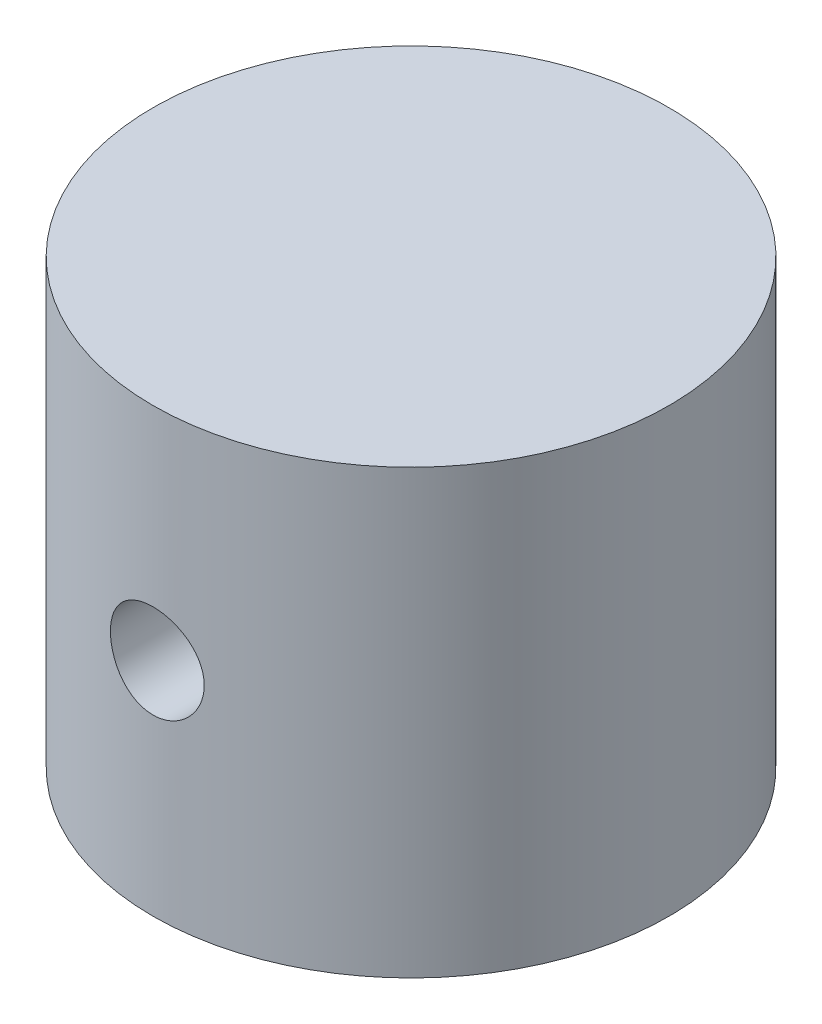
ISO-10303-21;
HEADER;
FILE_DESCRIPTION(('STEP AP214'),'2;1');
FILE_NAME('part.step','',(''),(''),'','','');
FILE_SCHEMA(('AUTOMOTIVE_DESIGN { 1 0 10303 214 1 1 1 1 }'));
ENDSEC;
DATA;
#1=APPLICATION_CONTEXT('core data for automotive mechanical design processes');
#2=APPLICATION_PROTOCOL_DEFINITION('international standard','automotive_design',2000,#1);
#3=PRODUCT_CONTEXT('',#1,'mechanical');
#4=PRODUCT('Part','Part','',(#3));
#5=PRODUCT_RELATED_PRODUCT_CATEGORY('part','',(#4));
#6=PRODUCT_DEFINITION_FORMATION('','',#4);
#7=PRODUCT_DEFINITION_CONTEXT('part definition',#1,'design');
#8=PRODUCT_DEFINITION('design','',#6,#7);
#9=PRODUCT_DEFINITION_SHAPE('','',#8);
#10=(LENGTH_UNIT() NAMED_UNIT(*) SI_UNIT(.MILLI.,.METRE.));
#11=(NAMED_UNIT(*) PLANE_ANGLE_UNIT() SI_UNIT($,.RADIAN.));
#12=(NAMED_UNIT(*) SI_UNIT($,.STERADIAN.) SOLID_ANGLE_UNIT());
#13=UNCERTAINTY_MEASURE_WITH_UNIT(LENGTH_MEASURE(1.E-05),#10,'distance_accuracy_value','');
#14=(GEOMETRIC_REPRESENTATION_CONTEXT(3) GLOBAL_UNCERTAINTY_ASSIGNED_CONTEXT((#13)) GLOBAL_UNIT_ASSIGNED_CONTEXT((#10,
#11,#12)) REPRESENTATION_CONTEXT('',''));
#15=CARTESIAN_POINT('',(0.,0.,0.));
#16=DIRECTION('',(0.,0.,1.));
#17=DIRECTION('',(1.,0.,0.));
#18=AXIS2_PLACEMENT_3D('',#15,#16,#17);
#19=CARTESIAN_POINT('',(0.,19.05,0.));
#20=DIRECTION('',(0.,-1.,0.));
#21=DIRECTION('',(0.,0.,-1.));
#22=AXIS2_PLACEMENT_3D('',#19,#20,#21);
#23=CYLINDRICAL_SURFACE('',#22,11.1125);
#24=CARTESIAN_POINT('',(0.,7.50570000000001,11.1125));
#25=CARTESIAN_POINT('',(-0.112432989835848,7.50570436150491,11.1124979885135));
#26=CARTESIAN_POINT('',(-0.224923464028336,7.51512199671043,11.1107759910982));
#27=CARTESIAN_POINT('',(-0.446738800050732,7.55252194279088,11.1040725309227));
#28=CARTESIAN_POINT('',(-0.556060835375273,7.58052032759811,11.0990882460572));
#29=CARTESIAN_POINT('',(-0.768298906333763,7.65419970242641,11.0864182001841));
#30=CARTESIAN_POINT('',(-0.871220478811337,7.69986515509431,11.0787348134541));
#31=CARTESIAN_POINT('',(-1.06793046786883,7.80753924768073,11.061507249447));
#32=CARTESIAN_POINT('',(-1.16171971015113,7.86954640817625,11.0519632406332));
#33=CARTESIAN_POINT('',(-1.33857114932866,8.00888665388069,11.0319488145126));
#34=CARTESIAN_POINT('',(-1.42151542062313,8.08636822230584,11.0214700131922));
#35=CARTESIAN_POINT('',(-1.57330269206051,8.25413838739104,11.0008298095361));
#36=CARTESIAN_POINT('',(-1.64214471617645,8.34442786976485,10.9906684292106));
#37=CARTESIAN_POINT('',(-1.76425868450196,8.53607760286817,10.9717321974533));
#38=CARTESIAN_POINT('',(-1.81741162866862,8.63751483987494,10.962968163853));
#39=CARTESIAN_POINT('',(-1.90587706819593,8.8480647434077,10.9479365709283));
#40=CARTESIAN_POINT('',(-1.94119100460101,8.95717678914711,10.9416688099623));
#41=CARTESIAN_POINT('',(-1.99259950030998,9.17872049409758,10.9324235642105));
#42=CARTESIAN_POINT('',(-2.00889913913689,9.29110307262807,10.9294109970154));
#43=CARTESIAN_POINT('',(-2.02245270731999,9.51704521572793,10.9269113681271));
#44=CARTESIAN_POINT('',(-2.01970823980587,9.63060468042365,10.9274240096824));
#45=CARTESIAN_POINT('',(-1.99541800961589,9.85419763764988,10.9318849084541));
#46=CARTESIAN_POINT('',(-1.9741046235945,9.96425734645282,10.9357907011094));
#47=CARTESIAN_POINT('',(-1.91364715344983,10.1792123971686,10.9465311853228));
#48=CARTESIAN_POINT('',(-1.8745023535377,10.2841075315776,10.9533659944568));
#49=CARTESIAN_POINT('',(-1.77926358030447,10.4864403084227,10.9692392211542));
#50=CARTESIAN_POINT('',(-1.72307500922542,10.5838324232528,10.9782898818098));
#51=CARTESIAN_POINT('',(-1.59541065673932,10.7678936345714,10.9975668225337));
#52=CARTESIAN_POINT('',(-1.52393341523826,10.8545617056468,11.0077932148433));
#53=CARTESIAN_POINT('',(-1.36646399655507,11.0160579883667,11.0284548489435));
#54=CARTESIAN_POINT('',(-1.28027287810177,11.0906922458076,11.0388909434048));
#55=CARTESIAN_POINT('',(-1.09649010187879,11.2244704908715,11.0586569463704));
#56=CARTESIAN_POINT('',(-0.998898342601528,11.2836143405577,11.0679868450241));
#57=CARTESIAN_POINT('',(-0.794888014920551,11.3847582875609,11.0845063665263));
#58=CARTESIAN_POINT('',(-0.688459674225094,11.4267390922553,11.0916935783821));
#59=CARTESIAN_POINT('',(-0.46990236616656,11.4921738486083,11.1030991079195));
#60=CARTESIAN_POINT('',(-0.357773968215309,11.5156296469815,11.1073177215291));
#61=CARTESIAN_POINT('',(-0.132668989316133,11.5430806392115,11.1122703306445));
#62=CARTESIAN_POINT('',(-0.0197258459973353,11.5473417255773,11.1130519332993));
#63=CARTESIAN_POINT('',(0.205259445528221,11.5369943094525,11.1111736388897));
#64=CARTESIAN_POINT('',(0.317301634969172,11.5223866755345,11.1085139002385));
#65=CARTESIAN_POINT('',(0.536467555565953,11.474937579232,11.1000813655338));
#66=CARTESIAN_POINT('',(0.643621188415334,11.4422298206527,11.0943314055113));
#67=CARTESIAN_POINT('',(0.850924000538067,11.3596529918104,11.0803604679232));
#68=CARTESIAN_POINT('',(0.951072726625845,11.3097828124502,11.0721393306656));
#69=CARTESIAN_POINT('',(1.14266349464334,11.193702373107,11.0540192797018));
#70=CARTESIAN_POINT('',(1.23400487596753,11.1273285936664,11.044103907104));
#71=CARTESIAN_POINT('',(1.40434832122246,10.9803473811946,11.0237396081454));
#72=CARTESIAN_POINT('',(1.48334930648381,10.8997387052069,11.0132906352486));
#73=CARTESIAN_POINT('',(1.62777265645694,10.7253752732362,10.9928800057886));
#74=CARTESIAN_POINT('',(1.69301407103818,10.6314695932729,10.9829260191508));
#75=CARTESIAN_POINT('',(1.80679655254052,10.4338754290993,10.9647834424417));
#76=CARTESIAN_POINT('',(1.8553382159517,10.3301872944722,10.9565947893193));
#77=CARTESIAN_POINT('',(1.93408262192782,10.1164443577046,10.9429694676423));
#78=CARTESIAN_POINT('',(1.96437035592409,10.0064217163337,10.9375200649759));
#79=CARTESIAN_POINT('',(2.00601092575811,9.78274162061928,10.9299603000043));
#80=CARTESIAN_POINT('',(2.01736575391525,9.66908455001169,10.9278495863684));
#81=CARTESIAN_POINT('',(2.02075470197014,9.44317271789469,10.9272232398915));
#82=CARTESIAN_POINT('',(2.01307406030948,9.33092228252498,10.9286545311314));
#83=CARTESIAN_POINT('',(1.97923235108116,9.10934049737376,10.9348336294031));
#84=CARTESIAN_POINT('',(1.9530713783497,9.00000913261534,10.9395814194155));
#85=CARTESIAN_POINT('',(1.88312883400479,8.787510008679,10.951836829957));
#86=CARTESIAN_POINT('',(1.83937633042677,8.68433240250043,10.9593398959369));
#87=CARTESIAN_POINT('',(1.73552329480196,8.4867363507964,10.9762639864209));
#88=CARTESIAN_POINT('',(1.67542170554132,8.39231847224853,10.9856851349478));
#89=CARTESIAN_POINT('',(1.53957725442834,8.21348961465146,11.0055496471138));
#90=CARTESIAN_POINT('',(1.46362612960233,8.12923820424464,11.0160055330534));
#91=CARTESIAN_POINT('',(1.29867447421249,7.97458031213191,11.0366659687779));
#92=CARTESIAN_POINT('',(1.20967094782521,7.9041770175928,11.0468704602323));
#93=CARTESIAN_POINT('',(1.02024909492466,7.77866579816433,11.0659783406538));
#94=CARTESIAN_POINT('',(0.919741365011603,7.72369098850701,11.0748701101347));
#95=CARTESIAN_POINT('',(0.710789816655407,7.63149398733369,11.09023745001));
#96=CARTESIAN_POINT('',(0.602353698433076,7.59425482796213,11.0967153284989));
#97=CARTESIAN_POINT('',(0.411306544377563,7.54629937119296,11.1051772350311));
#98=CARTESIAN_POINT('',(0.329824305020888,7.53110014533877,11.1079080067159));
#99=CARTESIAN_POINT('',(0.165571749881169,7.51079896910398,11.1115701093197));
#100=CARTESIAN_POINT('',(0.0828014635791193,7.50569678796242,11.1125014813626));
#101=CARTESIAN_POINT('',(0.,7.50570000000001,11.1125));
#102=B_SPLINE_CURVE_WITH_KNOTS('',3,(#24,#25,#26,#27,#28,#29,#30,#31,#32,#33,#34,#35,#36,#37,
#38,#39,#40,#41,#42,#43,#44,#45,#46,#47,#48,#49,#50,#51,#52,#53,#54,#55,#56,#57,#58,#59,#60,#61,
#62,#63,#64,#65,#66,#67,#68,#69,#70,#71,#72,#73,#74,#75,#76,#77,#78,#79,#80,#81,#82,#83,#84,#85,
#86,#87,#88,#89,#90,#91,#92,#93,#94,#95,#96,#97,#98,#99,#100,#101),.UNSPECIFIED.,.T.,.F.,(4,2,2,
2,2,2,2,2,2,2,2,2,2,2,2,2,2,2,2,2,2,2,2,2,2,2,2,2,2,2,2,2,2,2,2,2,2,2,4),(0.,0.336996202624952,
0.674284316380848,1.01127647297664,1.34823813197692,1.68860350423484,2.02899242547922,
2.3719004640407,2.71478079787919,3.05392775101648,3.39304615516619,3.72798072322002,
4.06292873740646,4.39977092309276,4.73664529215482,5.07849933289812,5.42035641763034,
5.76259672719318,6.10480291531109,6.44225385653523,6.77968926463192,7.11466471580605,
7.44966181836008,7.78812049165927,8.12660873296895,8.46930355200641,8.81198612922756,
9.15306057434714,9.49409912576209,9.83005834478045,10.1660158397568,10.5014204691528,
10.8368467926518,11.1769946871033,11.5172207757901,11.8602978766062,12.2030460898537,
12.451233179623,12.6994145971828),.UNSPECIFIED.);
#103=CARTESIAN_POINT('',(0.,7.50570000000001,11.1125));
#104=VERTEX_POINT('',#103);
#105=EDGE_CURVE('E11',#104,#104,#102,.T.);
#106=ORIENTED_EDGE('',*,*,#105,.T.);
#107=EDGE_LOOP('',(#106));
#108=FACE_BOUND('',#107,.T.);
#109=CARTESIAN_POINT('',(0.,19.05,0.));
#110=DIRECTION('',(0.,1.,0.));
#111=DIRECTION('',(0.,0.,1.));
#112=AXIS2_PLACEMENT_3D('',#109,#110,#111);
#113=CIRCLE('',#112,11.1125);
#114=CARTESIAN_POINT('',(0.,19.05,11.1125));
#115=VERTEX_POINT('',#114);
#116=EDGE_CURVE('E54',#115,#115,#113,.T.);
#117=ORIENTED_EDGE('',*,*,#116,.F.);
#118=EDGE_LOOP('',(#117));
#119=FACE_BOUND('',#118,.T.);
#120=CARTESIAN_POINT('',(0.,0.,0.));
#121=DIRECTION('',(0.,1.,0.));
#122=DIRECTION('',(0.,0.,1.));
#123=AXIS2_PLACEMENT_3D('',#120,#121,#122);
#124=CIRCLE('',#123,11.1125);
#125=CARTESIAN_POINT('',(0.,0.,11.1125));
#126=VERTEX_POINT('',#125);
#127=EDGE_CURVE('E66',#126,#126,#124,.T.);
#128=ORIENTED_EDGE('',*,*,#127,.T.);
#129=EDGE_LOOP('',(#128));
#130=FACE_BOUND('',#129,.T.);
#131=ADVANCED_FACE('F43',(#108,#119,#130),#23,.T.);
#132=CARTESIAN_POINT('',(0.,19.05,0.));
#133=DIRECTION('',(0.,1.,0.));
#134=DIRECTION('',(0.,0.,1.));
#135=AXIS2_PLACEMENT_3D('',#132,#133,#134);
#136=PLANE('',#135);
#137=ORIENTED_EDGE('',*,*,#116,.T.);
#138=EDGE_LOOP('',(#137));
#139=FACE_BOUND('',#138,.T.);
#140=ADVANCED_FACE('F73',(#139),#136,.T.);
#141=CARTESIAN_POINT('',(0.,0.,0.));
#142=DIRECTION('',(0.,1.,0.));
#143=DIRECTION('',(0.,0.,1.));
#144=AXIS2_PLACEMENT_3D('',#141,#142,#143);
#145=PLANE('',#144);
#146=ORIENTED_EDGE('',*,*,#127,.F.);
#147=EDGE_LOOP('',(#146));
#148=FACE_BOUND('',#147,.T.);
#149=ADVANCED_FACE('F80',(#148),#145,.F.);
#150=CARTESIAN_POINT('',(0.,9.525,11.1125));
#151=DIRECTION('',(0.,0.,1.));
#152=DIRECTION('',(0.,-1.,0.));
#153=AXIS2_PLACEMENT_3D('',#150,#151,#152);
#154=CYLINDRICAL_SURFACE('',#153,2.01929999999999);
#155=CARTESIAN_POINT('',(0.,9.525,-0.0635000000000011));
#156=DIRECTION('',(0.,0.,1.));
#157=DIRECTION('',(0.,-1.,0.));
#158=AXIS2_PLACEMENT_3D('',#155,#156,#157);
#159=CIRCLE('',#158,2.0193);
#160=CARTESIAN_POINT('',(0.,7.50570000000001,-0.0635000000000017));
#161=VERTEX_POINT('',#160);
#162=EDGE_CURVE('E64',#161,#161,#159,.T.);
#163=ORIENTED_EDGE('',*,*,#162,.F.);
#164=EDGE_LOOP('',(#163));
#165=FACE_BOUND('',#164,.T.);
#166=ORIENTED_EDGE('',*,*,#105,.F.);
#167=EDGE_LOOP('',(#166));
#168=FACE_BOUND('',#167,.T.);
#169=ADVANCED_FACE('F60',(#165,#168),#154,.F.);
#170=CARTESIAN_POINT('',(0.,9.525,-0.0635000000000011));
#171=DIRECTION('',(0.,0.,1.));
#172=DIRECTION('',(0.,-1.,0.));
#173=AXIS2_PLACEMENT_3D('',#170,#171,#172);
#174=CONICAL_SURFACE('',#173,2.0193,1.02974425867665);
#175=CARTESIAN_POINT('',(0.,9.525,-1.27681784800235));
#176=VERTEX_POINT('',#175);
#177=VERTEX_LOOP('',#176);
#178=FACE_BOUND('',#177,.T.);
#179=ORIENTED_EDGE('',*,*,#162,.T.);
#180=EDGE_LOOP('',(#179));
#181=FACE_BOUND('',#180,.T.);
#182=ADVANCED_FACE('F57',(#178,#181),#174,.F.);
#183=CLOSED_SHELL('',(#131,#140,#149,#169,#182));
#184=MANIFOLD_SOLID_BREP('B2',#183);
#185=ADVANCED_BREP_SHAPE_REPRESENTATION('',(#18,#184),#14);
#186=SHAPE_DEFINITION_REPRESENTATION(#9,#185);
ENDSEC;
END-ISO-10303-21;
